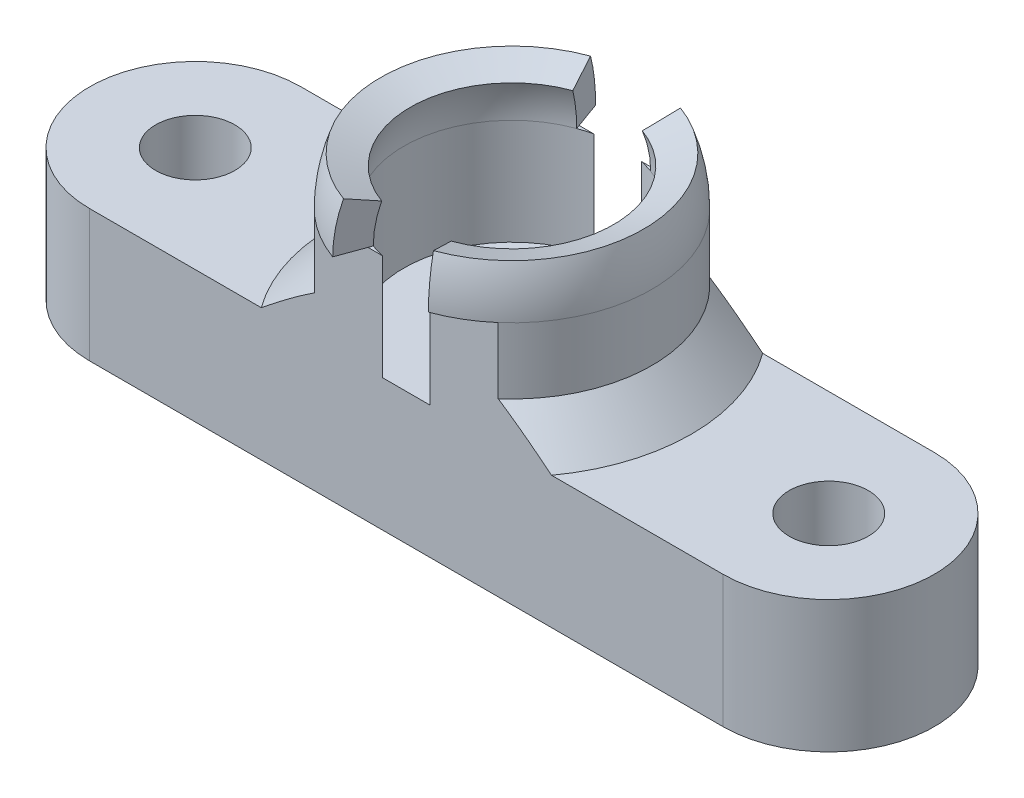
ISO-10303-21;
HEADER;
FILE_DESCRIPTION(('STEP AP214'),'2;1');
FILE_NAME('part.step','',(''),(''),'','','');
FILE_SCHEMA(('AUTOMOTIVE_DESIGN { 1 0 10303 214 1 1 1 1 }'));
ENDSEC;
DATA;
#1=APPLICATION_CONTEXT('core data for automotive mechanical design processes');
#2=APPLICATION_PROTOCOL_DEFINITION('international standard','automotive_design',2000,#1);
#3=PRODUCT_CONTEXT('',#1,'mechanical');
#4=PRODUCT('Part','Part','',(#3));
#5=PRODUCT_RELATED_PRODUCT_CATEGORY('part','',(#4));
#6=PRODUCT_DEFINITION_FORMATION('','',#4);
#7=PRODUCT_DEFINITION_CONTEXT('part definition',#1,'design');
#8=PRODUCT_DEFINITION('design','',#6,#7);
#9=PRODUCT_DEFINITION_SHAPE('','',#8);
#10=(LENGTH_UNIT() NAMED_UNIT(*) SI_UNIT(.MILLI.,.METRE.));
#11=(NAMED_UNIT(*) PLANE_ANGLE_UNIT() SI_UNIT($,.RADIAN.));
#12=(NAMED_UNIT(*) SI_UNIT($,.STERADIAN.) SOLID_ANGLE_UNIT());
#13=UNCERTAINTY_MEASURE_WITH_UNIT(LENGTH_MEASURE(1.E-05),#10,'distance_accuracy_value','');
#14=(GEOMETRIC_REPRESENTATION_CONTEXT(3) GLOBAL_UNCERTAINTY_ASSIGNED_CONTEXT((#13)) GLOBAL_UNIT_ASSIGNED_CONTEXT((#10,
#11,#12)) REPRESENTATION_CONTEXT('',''));
#15=CARTESIAN_POINT('',(0.,0.,0.));
#16=DIRECTION('',(0.,0.,1.));
#17=DIRECTION('',(1.,0.,0.));
#18=AXIS2_PLACEMENT_3D('',#15,#16,#17);
#19=CARTESIAN_POINT('',(0.,9.,0.));
#20=DIRECTION('',(0.,1.,0.));
#21=DIRECTION('',(0.,0.,1.));
#22=AXIS2_PLACEMENT_3D('',#19,#20,#21);
#23=PLANE('',#22);
#24=DIRECTION('',(-1.,0.,0.));
#25=VECTOR('',#24,1.);
#26=CARTESIAN_POINT('',(0.,9.,-4.));
#27=LINE('',#26,#25);
#28=CARTESIAN_POINT('',(-0.89999999999999,9.,-4.));
#29=VERTEX_POINT('',#28);
#30=CARTESIAN_POINT('',(-1.4558809370648,9.,-4.));
#31=VERTEX_POINT('',#30);
#32=EDGE_CURVE('E294',#29,#31,#27,.T.);
#33=ORIENTED_EDGE('',*,*,#32,.T.);
#34=DIRECTION('',(-0.342020143325666,0.,-0.93969262078591));
#35=VECTOR('',#34,1.);
#36=CARTESIAN_POINT('',(0.,9.,0.));
#37=LINE('',#36,#35);
#38=CARTESIAN_POINT('',(-1.40228258763523,9.,-3.85273974522223));
#39=VERTEX_POINT('',#38);
#40=EDGE_CURVE('E236',#39,#31,#37,.T.);
#41=ORIENTED_EDGE('',*,*,#40,.F.);
#42=CARTESIAN_POINT('',(0.,9.,0.));
#43=DIRECTION('',(0.,1.,0.));
#44=DIRECTION('',(0.,0.,1.));
#45=AXIS2_PLACEMENT_3D('',#42,#43,#44);
#46=CIRCLE('',#45,4.1);
#47=EDGE_CURVE('E304',#29,#39,#46,.T.);
#48=ORIENTED_EDGE('',*,*,#47,.F.);
#49=EDGE_LOOP('',(#33,#41,#48));
#50=FACE_BOUND('',#49,.T.);
#51=ADVANCED_FACE('F43',(#50),#23,.T.);
#52=CARTESIAN_POINT('',(0.,9.,0.));
#53=DIRECTION('',(0.,1.,0.));
#54=DIRECTION('',(0.,0.,1.));
#55=AXIS2_PLACEMENT_3D('',#52,#53,#54);
#56=PLANE('',#55);
#57=CARTESIAN_POINT('',(0.,9.,0.));
#58=DIRECTION('',(0.,1.,0.));
#59=DIRECTION('',(0.,0.,1.));
#60=AXIS2_PLACEMENT_3D('',#57,#58,#59);
#61=CIRCLE('',#60,4.1);
#62=CARTESIAN_POINT('',(0.899999999999988,9.,-4.));
#63=VERTEX_POINT('',#62);
#64=CARTESIAN_POINT('',(1.40228258763523,9.,-3.85273974522223));
#65=VERTEX_POINT('',#64);
#66=EDGE_CURVE('E331',#63,#65,#61,.F.);
#67=ORIENTED_EDGE('',*,*,#66,.T.);
#68=DIRECTION('',(0.342020143325666,0.,-0.93969262078591));
#69=VECTOR('',#68,1.);
#70=CARTESIAN_POINT('',(0.,9.,0.));
#71=LINE('',#70,#69);
#72=CARTESIAN_POINT('',(1.4558809370648,9.,-4.));
#73=VERTEX_POINT('',#72);
#74=EDGE_CURVE('E271',#65,#73,#71,.T.);
#75=ORIENTED_EDGE('',*,*,#74,.T.);
#76=DIRECTION('',(-1.,0.,0.));
#77=VECTOR('',#76,1.);
#78=CARTESIAN_POINT('',(0.,9.,-4.));
#79=LINE('',#78,#77);
#80=EDGE_CURVE('E326',#73,#63,#79,.T.);
#81=ORIENTED_EDGE('',*,*,#80,.T.);
#82=EDGE_LOOP('',(#67,#75,#81));
#83=FACE_BOUND('',#82,.T.);
#84=ADVANCED_FACE('F490',(#83),#56,.T.);
#85=CARTESIAN_POINT('',(0.,5.,0.));
#86=DIRECTION('',(0.,1.,0.));
#87=DIRECTION('',(0.,0.,1.));
#88=AXIS2_PLACEMENT_3D('',#85,#86,#87);
#89=PLANE('',#88);
#90=CARTESIAN_POINT('',(-12.,5.,0.));
#91=DIRECTION('',(0.,1.,0.));
#92=DIRECTION('',(0.,0.,1.));
#93=AXIS2_PLACEMENT_3D('',#90,#91,#92);
#94=CIRCLE('',#93,1.5);
#95=CARTESIAN_POINT('',(-12.,5.,1.5));
#96=VERTEX_POINT('',#95);
#97=EDGE_CURVE('E366',#96,#96,#94,.T.);
#98=ORIENTED_EDGE('',*,*,#97,.F.);
#99=EDGE_LOOP('',(#98));
#100=FACE_BOUND('',#99,.T.);
#101=DIRECTION('',(-1.,0.,0.));
#102=VECTOR('',#101,1.);
#103=CARTESIAN_POINT('',(0.,5.,4.));
#104=LINE('',#103,#102);
#105=CARTESIAN_POINT('',(-5.49909083394701,5.,4.));
#106=VERTEX_POINT('',#105);
#107=CARTESIAN_POINT('',(-12.,5.,4.));
#108=VERTEX_POINT('',#107);
#109=EDGE_CURVE('E363',#106,#108,#104,.T.);
#110=ORIENTED_EDGE('',*,*,#109,.F.);
#111=CARTESIAN_POINT('',(0.,5.,0.));
#112=DIRECTION('',(0.,1.,0.));
#113=DIRECTION('',(0.,0.,1.));
#114=AXIS2_PLACEMENT_3D('',#111,#112,#113);
#115=CIRCLE('',#114,6.8);
#116=CARTESIAN_POINT('',(-5.499090833947,5.,-4.));
#117=VERTEX_POINT('',#116);
#118=EDGE_CURVE('E397',#106,#117,#115,.F.);
#119=ORIENTED_EDGE('',*,*,#118,.T.);
#120=DIRECTION('',(1.,0.,0.));
#121=VECTOR('',#120,1.);
#122=CARTESIAN_POINT('',(0.,5.,-4.));
#123=LINE('',#122,#121);
#124=CARTESIAN_POINT('',(-12.,5.,-4.));
#125=VERTEX_POINT('',#124);
#126=EDGE_CURVE('E356',#125,#117,#123,.T.);
#127=ORIENTED_EDGE('',*,*,#126,.F.);
#128=CARTESIAN_POINT('',(-12.,5.,0.));
#129=DIRECTION('',(0.,1.,0.));
#130=DIRECTION('',(0.,0.,1.));
#131=AXIS2_PLACEMENT_3D('',#128,#129,#130);
#132=CIRCLE('',#131,4.);
#133=EDGE_CURVE('E359',#108,#125,#132,.F.);
#134=ORIENTED_EDGE('',*,*,#133,.F.);
#135=EDGE_LOOP('',(#110,#119,#127,#134));
#136=FACE_BOUND('',#135,.T.);
#137=ADVANCED_FACE('F453',(#100,#136),#89,.T.);
#138=CARTESIAN_POINT('',(-0.89999999999999,5.,-4.));
#139=VERTEX_POINT('',#138);
#140=CARTESIAN_POINT('',(0.899999999999988,5.,-4.));
#141=VERTEX_POINT('',#140);
#142=EDGE_CURVE('E360',#139,#141,#123,.T.);
#143=ORIENTED_EDGE('',*,*,#142,.F.);
#144=CARTESIAN_POINT('',(0.,5.,0.));
#145=DIRECTION('',(0.,1.,0.));
#146=DIRECTION('',(0.,0.,1.));
#147=AXIS2_PLACEMENT_3D('',#144,#145,#146);
#148=CIRCLE('',#147,4.1);
#149=CARTESIAN_POINT('',(-0.900000000000005,5.,4.));
#150=VERTEX_POINT('',#149);
#151=EDGE_CURVE('E308',#139,#150,#148,.T.);
#152=ORIENTED_EDGE('',*,*,#151,.T.);
#153=CARTESIAN_POINT('',(0.900000000000007,5.,4.));
#154=VERTEX_POINT('',#153);
#155=EDGE_CURVE('E367',#154,#150,#104,.T.);
#156=ORIENTED_EDGE('',*,*,#155,.F.);
#157=CARTESIAN_POINT('',(0.,5.,0.));
#158=DIRECTION('',(0.,1.,0.));
#159=DIRECTION('',(0.,0.,1.));
#160=AXIS2_PLACEMENT_3D('',#157,#158,#159);
#161=CIRCLE('',#160,4.1);
#162=EDGE_CURVE('E293',#141,#154,#161,.F.);
#163=ORIENTED_EDGE('',*,*,#162,.F.);
#164=EDGE_LOOP('',(#143,#152,#156,#163));
#165=FACE_BOUND('',#164,.T.);
#166=ADVANCED_FACE('F567',(#165),#89,.T.);
#167=CARTESIAN_POINT('',(12.,5.,0.));
#168=DIRECTION('',(0.,-1.,0.));
#169=DIRECTION('',(0.,0.,-1.));
#170=AXIS2_PLACEMENT_3D('',#167,#168,#169);
#171=CYLINDRICAL_SURFACE('',#170,4.);
#172=CARTESIAN_POINT('',(12.,0.,0.));
#173=DIRECTION('',(0.,1.,0.));
#174=DIRECTION('',(0.,0.,1.));
#175=AXIS2_PLACEMENT_3D('',#172,#173,#174);
#176=CIRCLE('',#175,4.);
#177=CARTESIAN_POINT('',(12.,0.,-4.));
#178=VERTEX_POINT('',#177);
#179=CARTESIAN_POINT('',(12.,0.,4.));
#180=VERTEX_POINT('',#179);
#181=EDGE_CURVE('E373',#178,#180,#176,.F.);
#182=ORIENTED_EDGE('',*,*,#181,.F.);
#183=DIRECTION('',(0.,-1.,0.));
#184=VECTOR('',#183,1.);
#185=CARTESIAN_POINT('',(12.,5.,-4.));
#186=LINE('',#185,#184);
#187=CARTESIAN_POINT('',(12.,5.,-4.));
#188=VERTEX_POINT('',#187);
#189=EDGE_CURVE('E392',#188,#178,#186,.T.);
#190=ORIENTED_EDGE('',*,*,#189,.F.);
#191=CARTESIAN_POINT('',(12.,5.,0.));
#192=DIRECTION('',(0.,1.,0.));
#193=DIRECTION('',(0.,0.,1.));
#194=AXIS2_PLACEMENT_3D('',#191,#192,#193);
#195=CIRCLE('',#194,4.);
#196=CARTESIAN_POINT('',(12.,5.,4.));
#197=VERTEX_POINT('',#196);
#198=EDGE_CURVE('E351',#188,#197,#195,.F.);
#199=ORIENTED_EDGE('',*,*,#198,.T.);
#200=DIRECTION('',(0.,-1.,0.));
#201=VECTOR('',#200,1.);
#202=CARTESIAN_POINT('',(12.,5.,4.));
#203=LINE('',#202,#201);
#204=EDGE_CURVE('E370',#197,#180,#203,.T.);
#205=ORIENTED_EDGE('',*,*,#204,.T.);
#206=EDGE_LOOP('',(#182,#190,#199,#205));
#207=FACE_BOUND('',#206,.T.);
#208=ADVANCED_FACE('F523',(#207),#171,.T.);
#209=CARTESIAN_POINT('',(0.,5.,-4.));
#210=DIRECTION('',(0.,0.,-1.));
#211=DIRECTION('',(-1.,0.,0.));
#212=AXIS2_PLACEMENT_3D('',#209,#210,#211);
#213=PLANE('',#212);
#214=DIRECTION('',(1.,0.,0.));
#215=VECTOR('',#214,1.);
#216=CARTESIAN_POINT('',(0.,0.,-4.));
#217=LINE('',#216,#215);
#218=CARTESIAN_POINT('',(-12.,0.,-4.));
#219=VERTEX_POINT('',#218);
#220=EDGE_CURVE('E376',#219,#178,#217,.T.);
#221=ORIENTED_EDGE('',*,*,#220,.F.);
#222=DIRECTION('',(0.,-1.,0.));
#223=VECTOR('',#222,1.);
#224=CARTESIAN_POINT('',(-12.,5.,-4.));
#225=LINE('',#224,#223);
#226=EDGE_CURVE('E390',#125,#219,#225,.T.);
#227=ORIENTED_EDGE('',*,*,#226,.F.);
#228=ORIENTED_EDGE('',*,*,#126,.T.);
#229=CARTESIAN_POINT('',(-5.499090833947,5.,-4.));
#230=CARTESIAN_POINT('',(-5.33583991350035,5.13196161324045,-4.));
#231=CARTESIAN_POINT('',(-5.17163626009542,5.26277078409141,-4.));
#232=CARTESIAN_POINT('',(-4.84089385745095,5.52119396351482,-4.));
#233=CARTESIAN_POINT('',(-4.67435654673117,5.64880981609131,-4.));
#234=CARTESIAN_POINT('',(-4.33828886818103,5.90014137534846,-4.));
#235=CARTESIAN_POINT('',(-4.16875785851448,6.0238562294378,-4.));
#236=CARTESIAN_POINT('',(-3.91166889987826,6.20558465723264,-4.));
#237=CARTESIAN_POINT('',(-3.82548112102879,6.26553741792785,-4.));
#238=CARTESIAN_POINT('',(-3.65207405573403,6.38394517771257,-4.));
#239=CARTESIAN_POINT('',(-3.56485469184516,6.44240006329642,-4.));
#240=CARTESIAN_POINT('',(-3.47706773014274,6.50000000000001,-4.));
#241=B_SPLINE_CURVE_WITH_KNOTS('',3,(#229,#230,#231,#232,#233,#234,#235,#236,#237,#238,#239,
#240),.UNSPECIFIED.,.F.,.F.,(4,2,2,2,2,4),(0.,0.629766314738074,1.25916015749011,
1.88869061854379,2.20364326728059,2.51861971227456),.UNSPECIFIED.);
#242=CARTESIAN_POINT('',(-3.47706773014274,6.50000000000001,-4.));
#243=VERTEX_POINT('',#242);
#244=EDGE_CURVE('E410',#117,#243,#241,.T.);
#245=ORIENTED_EDGE('',*,*,#244,.T.);
#246=DIRECTION('',(0.,-1.,0.));
#247=VECTOR('',#246,1.);
#248=CARTESIAN_POINT('',(-3.47706773014274,9.,-4.));
#249=LINE('',#248,#247);
#250=CARTESIAN_POINT('',(-3.47706773014274,9.,-4.));
#251=VERTEX_POINT('',#250);
#252=EDGE_CURVE('E319',#251,#243,#249,.T.);
#253=ORIENTED_EDGE('',*,*,#252,.F.);
#254=EDGE_CURVE('E298',#31,#251,#27,.T.);
#255=ORIENTED_EDGE('',*,*,#254,.F.);
#256=ORIENTED_EDGE('',*,*,#32,.F.);
#257=DIRECTION('',(0.,-1.,0.));
#258=VECTOR('',#257,1.);
#259=CARTESIAN_POINT('',(-0.89999999999999,9.,-4.));
#260=LINE('',#259,#258);
#261=EDGE_CURVE('E307',#29,#139,#260,.T.);
#262=ORIENTED_EDGE('',*,*,#261,.T.);
#263=ORIENTED_EDGE('',*,*,#142,.T.);
#264=DIRECTION('',(0.,-1.,0.));
#265=VECTOR('',#264,1.);
#266=CARTESIAN_POINT('',(0.899999999999988,9.,-4.));
#267=LINE('',#266,#265);
#268=EDGE_CURVE('E344',#63,#141,#267,.T.);
#269=ORIENTED_EDGE('',*,*,#268,.F.);
#270=ORIENTED_EDGE('',*,*,#80,.F.);
#271=CARTESIAN_POINT('',(3.47706773014274,9.,-4.));
#272=VERTEX_POINT('',#271);
#273=EDGE_CURVE('E327',#272,#73,#79,.T.);
#274=ORIENTED_EDGE('',*,*,#273,.F.);
#275=DIRECTION('',(0.,-1.,0.));
#276=VECTOR('',#275,1.);
#277=CARTESIAN_POINT('',(3.47706773014274,9.,-4.));
#278=LINE('',#277,#276);
#279=CARTESIAN_POINT('',(3.47706773014274,6.49999999999999,-4.));
#280=VERTEX_POINT('',#279);
#281=EDGE_CURVE('E310',#272,#280,#278,.T.);
#282=ORIENTED_EDGE('',*,*,#281,.T.);
#283=CARTESIAN_POINT('',(3.47706773014274,6.49999999999999,-4.));
#284=CARTESIAN_POINT('',(3.56485469184516,6.4424000632964,-4.));
#285=CARTESIAN_POINT('',(3.65207405573403,6.38394517771255,-4.));
#286=CARTESIAN_POINT('',(3.82548112102879,6.26553741792783,-4.));
#287=CARTESIAN_POINT('',(3.91166889987826,6.20558465723262,-4.));
#288=CARTESIAN_POINT('',(4.16875785851448,6.02385622943778,-4.));
#289=CARTESIAN_POINT('',(4.33828886818103,5.90014137534845,-4.));
#290=CARTESIAN_POINT('',(4.67435654673118,5.6488098160913,-4.));
#291=CARTESIAN_POINT('',(4.84089385745096,5.52119396351482,-4.));
#292=CARTESIAN_POINT('',(5.17163626009543,5.2627707840914,-4.));
#293=CARTESIAN_POINT('',(5.33583991350035,5.13196161324044,-4.));
#294=CARTESIAN_POINT('',(5.49909083394701,5.,-4.));
#295=B_SPLINE_CURVE_WITH_KNOTS('',3,(#283,#284,#285,#286,#287,#288,#289,#290,#291,#292,#293,
#294),.UNSPECIFIED.,.F.,.F.,(4,2,2,2,2,4),(0.,0.314976444993972,0.629929093730764,
1.25945955478445,1.88885339753648,2.51861971227455),.UNSPECIFIED.);
#296=CARTESIAN_POINT('',(5.49909083394701,5.,-4.));
#297=VERTEX_POINT('',#296);
#298=EDGE_CURVE('E11',#280,#297,#295,.T.);
#299=ORIENTED_EDGE('',*,*,#298,.T.);
#300=EDGE_CURVE('E355',#297,#188,#123,.T.);
#301=ORIENTED_EDGE('',*,*,#300,.T.);
#302=ORIENTED_EDGE('',*,*,#189,.T.);
#303=EDGE_LOOP('',(#221,#227,#228,#245,#253,#255,#256,#262,#263,#269,#270,#274,#282,#299,#301,#302));
#304=FACE_BOUND('',#303,.T.);
#305=ADVANCED_FACE('F437',(#304),#213,.T.);
#306=CARTESIAN_POINT('',(-12.,5.,0.));
#307=DIRECTION('',(0.,-1.,0.));
#308=DIRECTION('',(0.,0.,-1.));
#309=AXIS2_PLACEMENT_3D('',#306,#307,#308);
#310=CYLINDRICAL_SURFACE('',#309,4.);
#311=CARTESIAN_POINT('',(-12.,0.,0.));
#312=DIRECTION('',(0.,1.,0.));
#313=DIRECTION('',(0.,0.,1.));
#314=AXIS2_PLACEMENT_3D('',#311,#312,#313);
#315=CIRCLE('',#314,4.);
#316=CARTESIAN_POINT('',(-12.,0.,4.));
#317=VERTEX_POINT('',#316);
#318=EDGE_CURVE('E379',#317,#219,#315,.F.);
#319=ORIENTED_EDGE('',*,*,#318,.F.);
#320=DIRECTION('',(0.,-1.,0.));
#321=VECTOR('',#320,1.);
#322=CARTESIAN_POINT('',(-12.,5.,4.));
#323=LINE('',#322,#321);
#324=EDGE_CURVE('E388',#108,#317,#323,.T.);
#325=ORIENTED_EDGE('',*,*,#324,.F.);
#326=ORIENTED_EDGE('',*,*,#133,.T.);
#327=ORIENTED_EDGE('',*,*,#226,.T.);
#328=EDGE_LOOP('',(#319,#325,#326,#327));
#329=FACE_BOUND('',#328,.T.);
#330=ADVANCED_FACE('F425',(#329),#310,.T.);
#331=CARTESIAN_POINT('',(0.,5.,4.));
#332=DIRECTION('',(0.,0.,1.));
#333=DIRECTION('',(1.,0.,0.));
#334=AXIS2_PLACEMENT_3D('',#331,#332,#333);
#335=PLANE('',#334);
#336=DIRECTION('',(-1.,0.,0.));
#337=VECTOR('',#336,1.);
#338=CARTESIAN_POINT('',(0.,0.,4.));
#339=LINE('',#338,#337);
#340=EDGE_CURVE('E382',#180,#317,#339,.T.);
#341=ORIENTED_EDGE('',*,*,#340,.F.);
#342=ORIENTED_EDGE('',*,*,#204,.F.);
#343=CARTESIAN_POINT('',(5.49909083394701,5.,4.));
#344=VERTEX_POINT('',#343);
#345=EDGE_CURVE('E364',#197,#344,#104,.T.);
#346=ORIENTED_EDGE('',*,*,#345,.T.);
#347=CARTESIAN_POINT('',(5.49909083394701,5.,4.));
#348=CARTESIAN_POINT('',(5.33583991350036,5.13196161324044,4.));
#349=CARTESIAN_POINT('',(5.17163626009543,5.2627707840914,4.));
#350=CARTESIAN_POINT('',(4.84089385745096,5.52119396351482,4.));
#351=CARTESIAN_POINT('',(4.67435654673118,5.6488098160913,4.));
#352=CARTESIAN_POINT('',(4.33828886818104,5.90014137534845,4.));
#353=CARTESIAN_POINT('',(4.16875785851449,6.02385622943778,4.));
#354=CARTESIAN_POINT('',(3.91166889987826,6.20558465723262,4.));
#355=CARTESIAN_POINT('',(3.8254811210288,6.26553741792783,4.));
#356=CARTESIAN_POINT('',(3.65207405573404,6.38394517771255,4.));
#357=CARTESIAN_POINT('',(3.56485469184516,6.4424000632964,4.));
#358=CARTESIAN_POINT('',(3.47706773014274,6.49999999999999,4.));
#359=B_SPLINE_CURVE_WITH_KNOTS('',3,(#347,#348,#349,#350,#351,#352,#353,#354,#355,#356,#357,
#358),.UNSPECIFIED.,.F.,.F.,(4,2,2,2,2,4),(0.,0.629766314738071,1.2591601574901,
1.88869061854379,2.20364326728058,2.51861971227455),.UNSPECIFIED.);
#360=CARTESIAN_POINT('',(3.47706773014274,6.49999999999999,4.));
#361=VERTEX_POINT('',#360);
#362=EDGE_CURVE('E58',#344,#361,#359,.T.);
#363=ORIENTED_EDGE('',*,*,#362,.T.);
#364=DIRECTION('',(0.,-1.,0.));
#365=VECTOR('',#364,1.);
#366=CARTESIAN_POINT('',(3.47706773014274,9.,4.));
#367=LINE('',#366,#365);
#368=CARTESIAN_POINT('',(3.47706773014274,9.,4.));
#369=VERTEX_POINT('',#368);
#370=EDGE_CURVE('E337',#369,#361,#367,.T.);
#371=ORIENTED_EDGE('',*,*,#370,.F.);
#372=DIRECTION('',(1.,0.,0.));
#373=VECTOR('',#372,1.);
#374=CARTESIAN_POINT('',(0.,9.,4.));
#375=LINE('',#374,#373);
#376=CARTESIAN_POINT('',(1.4558809370648,9.,4.));
#377=VERTEX_POINT('',#376);
#378=EDGE_CURVE('E334',#377,#369,#375,.T.);
#379=ORIENTED_EDGE('',*,*,#378,.F.);
#380=CARTESIAN_POINT('',(0.900000000000007,9.,4.));
#381=VERTEX_POINT('',#380);
#382=EDGE_CURVE('E335',#381,#377,#375,.T.);
#383=ORIENTED_EDGE('',*,*,#382,.F.);
#384=DIRECTION('',(0.,-1.,0.));
#385=VECTOR('',#384,1.);
#386=CARTESIAN_POINT('',(0.900000000000007,9.,4.));
#387=LINE('',#386,#385);
#388=EDGE_CURVE('E341',#381,#154,#387,.T.);
#389=ORIENTED_EDGE('',*,*,#388,.T.);
#390=ORIENTED_EDGE('',*,*,#155,.T.);
#391=DIRECTION('',(0.,-1.,0.));
#392=VECTOR('',#391,1.);
#393=CARTESIAN_POINT('',(-0.900000000000005,9.,4.));
#394=LINE('',#393,#392);
#395=CARTESIAN_POINT('',(-0.900000000000005,9.,4.));
#396=VERTEX_POINT('',#395);
#397=EDGE_CURVE('E313',#396,#150,#394,.T.);
#398=ORIENTED_EDGE('',*,*,#397,.F.);
#399=DIRECTION('',(1.,0.,0.));
#400=VECTOR('',#399,1.);
#401=CARTESIAN_POINT('',(0.,9.,4.));
#402=LINE('',#401,#400);
#403=CARTESIAN_POINT('',(-1.4558809370648,9.,4.));
#404=VERTEX_POINT('',#403);
#405=EDGE_CURVE('E300',#404,#396,#402,.T.);
#406=ORIENTED_EDGE('',*,*,#405,.F.);
#407=CARTESIAN_POINT('',(-3.47706773014274,9.,4.));
#408=VERTEX_POINT('',#407);
#409=EDGE_CURVE('E301',#408,#404,#402,.T.);
#410=ORIENTED_EDGE('',*,*,#409,.F.);
#411=DIRECTION('',(0.,-1.,0.));
#412=VECTOR('',#411,1.);
#413=CARTESIAN_POINT('',(-3.47706773014274,9.,4.));
#414=LINE('',#413,#412);
#415=CARTESIAN_POINT('',(-3.47706773014274,6.50000000000001,4.));
#416=VERTEX_POINT('',#415);
#417=EDGE_CURVE('E316',#408,#416,#414,.T.);
#418=ORIENTED_EDGE('',*,*,#417,.T.);
#419=CARTESIAN_POINT('',(-3.47706773014274,6.50000000000001,4.));
#420=CARTESIAN_POINT('',(-3.56485469184516,6.44240006329642,4.));
#421=CARTESIAN_POINT('',(-3.65207405573404,6.38394517771257,4.));
#422=CARTESIAN_POINT('',(-3.8254811210288,6.26553741792785,4.));
#423=CARTESIAN_POINT('',(-3.91166889987826,6.20558465723264,4.));
#424=CARTESIAN_POINT('',(-4.16875785851448,6.0238562294378,4.));
#425=CARTESIAN_POINT('',(-4.33828886818103,5.90014137534846,4.));
#426=CARTESIAN_POINT('',(-4.67435654673117,5.64880981609131,4.));
#427=CARTESIAN_POINT('',(-4.84089385745096,5.52119396351482,4.));
#428=CARTESIAN_POINT('',(-5.17163626009542,5.26277078409141,4.));
#429=CARTESIAN_POINT('',(-5.33583991350035,5.13196161324045,4.));
#430=CARTESIAN_POINT('',(-5.49909083394701,5.,4.));
#431=B_SPLINE_CURVE_WITH_KNOTS('',3,(#419,#420,#421,#422,#423,#424,#425,#426,#427,#428,#429,
#430),.UNSPECIFIED.,.F.,.F.,(4,2,2,2,2,4),(0.,0.314976444993971,0.629929093730764,
1.25945955478445,1.88885339753648,2.51861971227456),.UNSPECIFIED.);
#432=EDGE_CURVE('E403',#416,#106,#431,.T.);
#433=ORIENTED_EDGE('',*,*,#432,.T.);
#434=ORIENTED_EDGE('',*,*,#109,.T.);
#435=ORIENTED_EDGE('',*,*,#324,.T.);
#436=EDGE_LOOP('',(#341,#342,#346,#363,#371,#379,#383,#389,#390,#398,#406,#410,#418,#433,#434,#435));
#437=FACE_BOUND('',#436,.T.);
#438=ADVANCED_FACE('F419',(#437),#335,.T.);
#439=CARTESIAN_POINT('',(12.,5.,0.));
#440=DIRECTION('',(0.,-1.,0.));
#441=DIRECTION('',(0.,0.,-1.));
#442=AXIS2_PLACEMENT_3D('',#439,#440,#441);
#443=CYLINDRICAL_SURFACE('',#442,1.5);
#444=CARTESIAN_POINT('',(12.,5.,0.));
#445=DIRECTION('',(0.,1.,0.));
#446=DIRECTION('',(0.,0.,1.));
#447=AXIS2_PLACEMENT_3D('',#444,#445,#446);
#448=CIRCLE('',#447,1.5);
#449=CARTESIAN_POINT('',(12.,5.,1.5));
#450=VERTEX_POINT('',#449);
#451=EDGE_CURVE('E348',#450,#450,#448,.T.);
#452=ORIENTED_EDGE('',*,*,#451,.T.);
#453=EDGE_LOOP('',(#452));
#454=FACE_BOUND('',#453,.T.);
#455=CARTESIAN_POINT('',(12.,0.,0.));
#456=DIRECTION('',(0.,1.,0.));
#457=DIRECTION('',(0.,0.,1.));
#458=AXIS2_PLACEMENT_3D('',#455,#456,#457);
#459=CIRCLE('',#458,1.5);
#460=CARTESIAN_POINT('',(12.,0.,1.5));
#461=VERTEX_POINT('',#460);
#462=EDGE_CURVE('E322',#461,#461,#459,.T.);
#463=ORIENTED_EDGE('',*,*,#462,.F.);
#464=EDGE_LOOP('',(#463));
#465=FACE_BOUND('',#464,.T.);
#466=ADVANCED_FACE('F424',(#454,#465),#443,.F.);
#467=CARTESIAN_POINT('',(-12.,5.,0.));
#468=DIRECTION('',(0.,-1.,0.));
#469=DIRECTION('',(0.,0.,-1.));
#470=AXIS2_PLACEMENT_3D('',#467,#468,#469);
#471=CYLINDRICAL_SURFACE('',#470,1.5);
#472=ORIENTED_EDGE('',*,*,#97,.T.);
#473=EDGE_LOOP('',(#472));
#474=FACE_BOUND('',#473,.T.);
#475=CARTESIAN_POINT('',(-12.,0.,0.));
#476=DIRECTION('',(0.,1.,0.));
#477=DIRECTION('',(0.,0.,1.));
#478=AXIS2_PLACEMENT_3D('',#475,#476,#477);
#479=CIRCLE('',#478,1.5);
#480=CARTESIAN_POINT('',(-12.,0.,1.5));
#481=VERTEX_POINT('',#480);
#482=EDGE_CURVE('E352',#481,#481,#479,.T.);
#483=ORIENTED_EDGE('',*,*,#482,.F.);
#484=EDGE_LOOP('',(#483));
#485=FACE_BOUND('',#484,.T.);
#486=ADVANCED_FACE('F426',(#474,#485),#471,.F.);
#487=ORIENTED_EDGE('',*,*,#451,.F.);
#488=EDGE_LOOP('',(#487));
#489=FACE_BOUND('',#488,.T.);
#490=ORIENTED_EDGE('',*,*,#300,.F.);
#491=CARTESIAN_POINT('',(0.,5.,0.));
#492=DIRECTION('',(0.,1.,0.));
#493=DIRECTION('',(0.,0.,1.));
#494=AXIS2_PLACEMENT_3D('',#491,#492,#493);
#495=CIRCLE('',#494,6.8);
#496=EDGE_CURVE('E399',#297,#344,#495,.F.);
#497=ORIENTED_EDGE('',*,*,#496,.T.);
#498=ORIENTED_EDGE('',*,*,#345,.F.);
#499=ORIENTED_EDGE('',*,*,#198,.F.);
#500=EDGE_LOOP('',(#490,#497,#498,#499));
#501=FACE_BOUND('',#500,.T.);
#502=ADVANCED_FACE('F518',(#489,#501),#89,.T.);
#503=CARTESIAN_POINT('',(0.,0.,0.));
#504=DIRECTION('',(0.,1.,0.));
#505=DIRECTION('',(0.,0.,1.));
#506=AXIS2_PLACEMENT_3D('',#503,#504,#505);
#507=PLANE('',#506);
#508=ORIENTED_EDGE('',*,*,#462,.T.);
#509=EDGE_LOOP('',(#508));
#510=FACE_BOUND('',#509,.T.);
#511=ORIENTED_EDGE('',*,*,#181,.T.);
#512=ORIENTED_EDGE('',*,*,#340,.T.);
#513=ORIENTED_EDGE('',*,*,#318,.T.);
#514=ORIENTED_EDGE('',*,*,#220,.T.);
#515=EDGE_LOOP('',(#511,#512,#513,#514));
#516=FACE_BOUND('',#515,.T.);
#517=ORIENTED_EDGE('',*,*,#482,.T.);
#518=EDGE_LOOP('',(#517));
#519=FACE_BOUND('',#518,.T.);
#520=ADVANCED_FACE('F526',(#510,#516,#519),#507,.F.);
#521=CARTESIAN_POINT('',(0.,9.,0.));
#522=DIRECTION('',(0.,-1.,0.));
#523=DIRECTION('',(0.,0.,-1.));
#524=AXIS2_PLACEMENT_3D('',#521,#522,#523);
#525=CYLINDRICAL_SURFACE('',#524,5.3);
#526=ORIENTED_EDGE('',*,*,#370,.T.);
#527=CARTESIAN_POINT('',(0.,6.49999999999999,0.));
#528=DIRECTION('',(0.,1.,0.));
#529=DIRECTION('',(0.,0.,1.));
#530=AXIS2_PLACEMENT_3D('',#527,#528,#529);
#531=CIRCLE('',#530,5.3);
#532=EDGE_CURVE('E71',#361,#280,#531,.T.);
#533=ORIENTED_EDGE('',*,*,#532,.T.);
#534=ORIENTED_EDGE('',*,*,#281,.F.);
#535=CARTESIAN_POINT('',(0.,9.,0.));
#536=DIRECTION('',(0.,1.,0.));
#537=DIRECTION('',(0.,0.,1.));
#538=AXIS2_PLACEMENT_3D('',#535,#536,#537);
#539=CIRCLE('',#538,5.3);
#540=EDGE_CURVE('E323',#272,#369,#539,.F.);
#541=ORIENTED_EDGE('',*,*,#540,.T.);
#542=EDGE_LOOP('',(#526,#533,#534,#541));
#543=FACE_BOUND('',#542,.T.);
#544=ADVANCED_FACE('F562',(#543),#525,.T.);
#545=CARTESIAN_POINT('',(0.,9.,0.));
#546=DIRECTION('',(0.,-1.,0.));
#547=DIRECTION('',(0.,0.,-1.));
#548=AXIS2_PLACEMENT_3D('',#545,#546,#547);
#549=CYLINDRICAL_SURFACE('',#548,4.1);
#550=ORIENTED_EDGE('',*,*,#162,.T.);
#551=ORIENTED_EDGE('',*,*,#388,.F.);
#552=CARTESIAN_POINT('',(1.40228258763523,9.,3.85273974522223));
#553=VERTEX_POINT('',#552);
#554=EDGE_CURVE('E330',#553,#381,#61,.F.);
#555=ORIENTED_EDGE('',*,*,#554,.F.);
#556=CARTESIAN_POINT('',(0.,9.,0.));
#557=DIRECTION('',(0.,-1.,0.));
#558=DIRECTION('',(0.,0.,-1.));
#559=AXIS2_PLACEMENT_3D('',#556,#557,#558);
#560=CIRCLE('',#559,4.1);
#561=EDGE_CURVE('E282',#65,#553,#560,.T.);
#562=ORIENTED_EDGE('',*,*,#561,.F.);
#563=ORIENTED_EDGE('',*,*,#66,.F.);
#564=ORIENTED_EDGE('',*,*,#268,.T.);
#565=EDGE_LOOP('',(#550,#551,#555,#562,#563,#564));
#566=FACE_BOUND('',#565,.T.);
#567=ADVANCED_FACE('F486',(#566),#549,.F.);
#568=DIRECTION('',(0.342020143325666,0.,0.93969262078591));
#569=VECTOR('',#568,1.);
#570=CARTESIAN_POINT('',(0.,9.,0.));
#571=LINE('',#570,#569);
#572=EDGE_CURVE('E258',#553,#377,#571,.T.);
#573=ORIENTED_EDGE('',*,*,#572,.F.);
#574=ORIENTED_EDGE('',*,*,#554,.T.);
#575=ORIENTED_EDGE('',*,*,#382,.T.);
#576=EDGE_LOOP('',(#573,#574,#575));
#577=FACE_BOUND('',#576,.T.);
#578=ADVANCED_FACE('F543',(#577),#56,.T.);
#579=CARTESIAN_POINT('',(0.,9.,0.));
#580=DIRECTION('',(0.,-1.,0.));
#581=DIRECTION('',(0.,0.,-1.));
#582=AXIS2_PLACEMENT_3D('',#579,#580,#581);
#583=CYLINDRICAL_SURFACE('',#582,5.3);
#584=ORIENTED_EDGE('',*,*,#252,.T.);
#585=CARTESIAN_POINT('',(0.,6.50000000000001,0.));
#586=DIRECTION('',(0.,1.,0.));
#587=DIRECTION('',(0.,0.,1.));
#588=AXIS2_PLACEMENT_3D('',#585,#586,#587);
#589=CIRCLE('',#588,5.3);
#590=EDGE_CURVE('E394',#243,#416,#589,.T.);
#591=ORIENTED_EDGE('',*,*,#590,.T.);
#592=ORIENTED_EDGE('',*,*,#417,.F.);
#593=CARTESIAN_POINT('',(0.,9.,0.));
#594=DIRECTION('',(0.,1.,0.));
#595=DIRECTION('',(0.,0.,1.));
#596=AXIS2_PLACEMENT_3D('',#593,#594,#595);
#597=CIRCLE('',#596,5.3);
#598=EDGE_CURVE('E297',#251,#408,#597,.T.);
#599=ORIENTED_EDGE('',*,*,#598,.F.);
#600=EDGE_LOOP('',(#584,#591,#592,#599));
#601=FACE_BOUND('',#600,.T.);
#602=ADVANCED_FACE('F445',(#601),#583,.T.);
#603=CARTESIAN_POINT('',(0.,9.,0.));
#604=DIRECTION('',(0.,-1.,0.));
#605=DIRECTION('',(0.,0.,-1.));
#606=AXIS2_PLACEMENT_3D('',#603,#604,#605);
#607=CYLINDRICAL_SURFACE('',#606,4.1);
#608=ORIENTED_EDGE('',*,*,#151,.F.);
#609=ORIENTED_EDGE('',*,*,#261,.F.);
#610=ORIENTED_EDGE('',*,*,#47,.T.);
#611=CARTESIAN_POINT('',(0.,9.,0.));
#612=DIRECTION('',(0.,-1.,0.));
#613=DIRECTION('',(0.,0.,-1.));
#614=AXIS2_PLACEMENT_3D('',#611,#612,#613);
#615=CIRCLE('',#614,4.1);
#616=CARTESIAN_POINT('',(-1.40228258763523,9.,3.85273974522223));
#617=VERTEX_POINT('',#616);
#618=EDGE_CURVE('E252',#617,#39,#615,.T.);
#619=ORIENTED_EDGE('',*,*,#618,.F.);
#620=EDGE_CURVE('E303',#617,#396,#46,.T.);
#621=ORIENTED_EDGE('',*,*,#620,.T.);
#622=ORIENTED_EDGE('',*,*,#397,.T.);
#623=EDGE_LOOP('',(#608,#609,#610,#619,#621,#622));
#624=FACE_BOUND('',#623,.T.);
#625=ADVANCED_FACE('F462',(#624),#607,.F.);
#626=DIRECTION('',(-0.342020143325666,0.,0.93969262078591));
#627=VECTOR('',#626,1.);
#628=CARTESIAN_POINT('',(0.,9.,0.));
#629=LINE('',#628,#627);
#630=EDGE_CURVE('E245',#617,#404,#629,.T.);
#631=ORIENTED_EDGE('',*,*,#630,.T.);
#632=ORIENTED_EDGE('',*,*,#405,.T.);
#633=ORIENTED_EDGE('',*,*,#620,.F.);
#634=EDGE_LOOP('',(#631,#632,#633));
#635=FACE_BOUND('',#634,.T.);
#636=ADVANCED_FACE('F467',(#635),#23,.T.);
#637=CARTESIAN_POINT('',(0.,9.,0.));
#638=DIRECTION('',(0.,-1.,0.));
#639=DIRECTION('',(0.,0.,-1.));
#640=AXIS2_PLACEMENT_3D('',#637,#638,#639);
#641=PLANE('',#640);
#642=CARTESIAN_POINT('',(0.,9.,0.));
#643=DIRECTION('',(0.,-1.,0.));
#644=DIRECTION('',(0.,0.,-1.));
#645=AXIS2_PLACEMENT_3D('',#642,#643,#644);
#646=CIRCLE('',#645,5.3);
#647=CARTESIAN_POINT('',(1.81270675962603,9.,-4.98037089016532));
#648=VERTEX_POINT('',#647);
#649=EDGE_CURVE('E290',#648,#272,#646,.T.);
#650=ORIENTED_EDGE('',*,*,#649,.T.);
#651=ORIENTED_EDGE('',*,*,#273,.T.);
#652=EDGE_CURVE('E270',#73,#648,#71,.T.);
#653=ORIENTED_EDGE('',*,*,#652,.T.);
#654=EDGE_LOOP('',(#650,#651,#653));
#655=FACE_BOUND('',#654,.T.);
#656=ADVANCED_FACE('F510',(#655),#641,.T.);
#657=CARTESIAN_POINT('',(1.81270675962603,9.,4.98037089016532));
#658=VERTEX_POINT('',#657);
#659=EDGE_CURVE('E221',#377,#658,#571,.T.);
#660=ORIENTED_EDGE('',*,*,#659,.F.);
#661=ORIENTED_EDGE('',*,*,#378,.T.);
#662=EDGE_CURVE('E289',#369,#658,#646,.T.);
#663=ORIENTED_EDGE('',*,*,#662,.T.);
#664=EDGE_LOOP('',(#660,#661,#663));
#665=FACE_BOUND('',#664,.T.);
#666=ADVANCED_FACE('F551',(#665),#641,.T.);
#667=CARTESIAN_POINT('',(0.,9.,0.));
#668=DIRECTION('',(0.,-1.,0.));
#669=DIRECTION('',(0.342020143325666,0.,-0.93969262078591));
#670=AXIS2_PLACEMENT_3D('',#667,#668,#669);
#671=SPHERICAL_SURFACE('',#670,5.3);
#672=CARTESIAN_POINT('',(0.,10.812706759626,0.));
#673=DIRECTION('',(0.,-1.,0.));
#674=DIRECTION('',(0.,0.,-1.));
#675=AXIS2_PLACEMENT_3D('',#672,#673,#674);
#676=CIRCLE('',#675,4.98037089016532);
#677=CARTESIAN_POINT('',(1.70338716566932,10.812706759626,-4.6800177742653));
#678=VERTEX_POINT('',#677);
#679=CARTESIAN_POINT('',(1.70338716566932,10.812706759626,4.6800177742653));
#680=VERTEX_POINT('',#679);
#681=EDGE_CURVE('E287',#678,#680,#676,.T.);
#682=ORIENTED_EDGE('',*,*,#681,.T.);
#683=CARTESIAN_POINT('',(0.,9.,0.));
#684=DIRECTION('',(-0.93969262078591,0.,0.342020143325666));
#685=DIRECTION('',(0.342020143325666,0.,0.93969262078591));
#686=AXIS2_PLACEMENT_3D('',#683,#684,#685);
#687=CIRCLE('',#686,5.3);
#688=EDGE_CURVE('E261',#658,#680,#687,.T.);
#689=ORIENTED_EDGE('',*,*,#688,.F.);
#690=ORIENTED_EDGE('',*,*,#662,.F.);
#691=ORIENTED_EDGE('',*,*,#540,.F.);
#692=ORIENTED_EDGE('',*,*,#649,.F.);
#693=CARTESIAN_POINT('',(0.,9.,0.));
#694=DIRECTION('',(0.93969262078591,0.,0.342020143325666));
#695=DIRECTION('',(0.342020143325666,0.,-0.93969262078591));
#696=AXIS2_PLACEMENT_3D('',#693,#694,#695);
#697=CIRCLE('',#696,5.3);
#698=EDGE_CURVE('E273',#648,#678,#697,.T.);
#699=ORIENTED_EDGE('',*,*,#698,.T.);
#700=EDGE_LOOP('',(#682,#689,#690,#691,#692,#699));
#701=FACE_BOUND('',#700,.T.);
#702=ADVANCED_FACE('F505',(#701),#671,.T.);
#703=CARTESIAN_POINT('',(0.,10.4022825876352,0.));
#704=DIRECTION('',(0.,1.,0.));
#705=DIRECTION('',(0.,0.,1.));
#706=AXIS2_PLACEMENT_3D('',#703,#704,#705);
#707=CONICAL_SURFACE('',#706,3.85273974522222,1.22173047639603);
#708=CARTESIAN_POINT('',(0.,10.4022825876352,0.));
#709=DIRECTION('',(0.,-1.,0.));
#710=DIRECTION('',(0.,0.,-1.));
#711=AXIS2_PLACEMENT_3D('',#708,#709,#710);
#712=CIRCLE('',#711,3.85273974522222);
#713=CARTESIAN_POINT('',(1.3177145998574,10.4022825876352,-3.62039110839391));
#714=VERTEX_POINT('',#713);
#715=CARTESIAN_POINT('',(1.3177145998574,10.4022825876352,3.62039110839391));
#716=VERTEX_POINT('',#715);
#717=EDGE_CURVE('E285',#714,#716,#712,.T.);
#718=ORIENTED_EDGE('',*,*,#717,.T.);
#719=DIRECTION('',(0.321393804843267,0.342020143325669,0.88302222155949));
#720=VECTOR('',#719,1.);
#721=CARTESIAN_POINT('',(-0.989308396768287,7.9471999940354,-2.71810248099775));
#722=LINE('',#721,#720);
#723=EDGE_CURVE('E264',#716,#680,#722,.T.);
#724=ORIENTED_EDGE('',*,*,#723,.T.);
#725=ORIENTED_EDGE('',*,*,#681,.F.);
#726=DIRECTION('',(0.321393804843267,0.342020143325669,-0.88302222155949));
#727=VECTOR('',#726,1.);
#728=CARTESIAN_POINT('',(-0.989308396768287,7.9471999940354,2.71810248099775));
#729=LINE('',#728,#727);
#730=EDGE_CURVE('E276',#714,#678,#729,.T.);
#731=ORIENTED_EDGE('',*,*,#730,.F.);
#732=EDGE_LOOP('',(#718,#724,#725,#731));
#733=FACE_BOUND('',#732,.T.);
#734=ADVANCED_FACE('F502',(#733),#707,.F.);
#735=CARTESIAN_POINT('',(0.,9.,0.));
#736=DIRECTION('',(0.,-1.,0.));
#737=DIRECTION('',(0.342020143325666,0.,-0.93969262078591));
#738=AXIS2_PLACEMENT_3D('',#735,#736,#737);
#739=SPHERICAL_SURFACE('',#738,4.1);
#740=CARTESIAN_POINT('',(0.,9.,0.));
#741=DIRECTION('',(0.93969262078591,0.,0.342020143325666));
#742=DIRECTION('',(0.342020143325666,0.,-0.93969262078591));
#743=AXIS2_PLACEMENT_3D('',#740,#741,#742);
#744=CIRCLE('',#743,4.1);
#745=EDGE_CURVE('E279',#65,#714,#744,.T.);
#746=ORIENTED_EDGE('',*,*,#745,.F.);
#747=ORIENTED_EDGE('',*,*,#561,.T.);
#748=CARTESIAN_POINT('',(0.,9.,0.));
#749=DIRECTION('',(-0.93969262078591,0.,0.342020143325666));
#750=DIRECTION('',(0.342020143325666,0.,0.93969262078591));
#751=AXIS2_PLACEMENT_3D('',#748,#749,#750);
#752=CIRCLE('',#751,4.1);
#753=EDGE_CURVE('E267',#553,#716,#752,.T.);
#754=ORIENTED_EDGE('',*,*,#753,.T.);
#755=ORIENTED_EDGE('',*,*,#717,.F.);
#756=EDGE_LOOP('',(#746,#747,#754,#755));
#757=FACE_BOUND('',#756,.T.);
#758=ADVANCED_FACE('F497',(#757),#739,.F.);
#759=CARTESIAN_POINT('',(0.,0.,0.));
#760=DIRECTION('',(0.93969262078591,0.,0.342020143325666));
#761=DIRECTION('',(0.342020143325666,0.,-0.93969262078591));
#762=AXIS2_PLACEMENT_3D('',#759,#760,#761);
#763=PLANE('',#762);
#764=ORIENTED_EDGE('',*,*,#74,.F.);
#765=ORIENTED_EDGE('',*,*,#745,.T.);
#766=ORIENTED_EDGE('',*,*,#730,.T.);
#767=ORIENTED_EDGE('',*,*,#698,.F.);
#768=ORIENTED_EDGE('',*,*,#652,.F.);
#769=EDGE_LOOP('',(#764,#765,#766,#767,#768));
#770=FACE_BOUND('',#769,.T.);
#771=ADVANCED_FACE('F494',(#770),#763,.F.);
#772=CARTESIAN_POINT('',(0.,0.,0.));
#773=DIRECTION('',(-0.93969262078591,0.,0.342020143325666));
#774=DIRECTION('',(0.342020143325666,0.,0.93969262078591));
#775=AXIS2_PLACEMENT_3D('',#772,#773,#774);
#776=PLANE('',#775);
#777=ORIENTED_EDGE('',*,*,#572,.T.);
#778=ORIENTED_EDGE('',*,*,#659,.T.);
#779=ORIENTED_EDGE('',*,*,#688,.T.);
#780=ORIENTED_EDGE('',*,*,#723,.F.);
#781=ORIENTED_EDGE('',*,*,#753,.F.);
#782=EDGE_LOOP('',(#777,#778,#779,#780,#781));
#783=FACE_BOUND('',#782,.T.);
#784=ADVANCED_FACE('F691',(#783),#776,.T.);
#785=CARTESIAN_POINT('',(0.,9.,0.));
#786=DIRECTION('',(0.,-1.,0.));
#787=DIRECTION('',(0.,0.,-1.));
#788=AXIS2_PLACEMENT_3D('',#785,#786,#787);
#789=PLANE('',#788);
#790=CARTESIAN_POINT('',(-1.81270675962603,9.,-4.98037089016532));
#791=VERTEX_POINT('',#790);
#792=EDGE_CURVE('E234',#31,#791,#37,.T.);
#793=ORIENTED_EDGE('',*,*,#792,.F.);
#794=ORIENTED_EDGE('',*,*,#254,.T.);
#795=CARTESIAN_POINT('',(0.,9.,0.));
#796=DIRECTION('',(0.,-1.,0.));
#797=DIRECTION('',(0.,0.,-1.));
#798=AXIS2_PLACEMENT_3D('',#795,#796,#797);
#799=CIRCLE('',#798,5.3);
#800=EDGE_CURVE('E255',#251,#791,#799,.T.);
#801=ORIENTED_EDGE('',*,*,#800,.T.);
#802=EDGE_LOOP('',(#793,#794,#801));
#803=FACE_BOUND('',#802,.T.);
#804=ADVANCED_FACE('F671',(#803),#789,.T.);
#805=CARTESIAN_POINT('',(0.,10.812706759626,0.));
#806=DIRECTION('',(0.,1.,0.));
#807=DIRECTION('',(0.,0.,1.));
#808=AXIS2_PLACEMENT_3D('',#805,#806,#807);
#809=CONICAL_SURFACE('',#808,4.98037089016532,1.22173047639603);
#810=CARTESIAN_POINT('',(0.,10.812706759626,0.));
#811=DIRECTION('',(0.,-1.,0.));
#812=DIRECTION('',(0.,0.,-1.));
#813=AXIS2_PLACEMENT_3D('',#810,#811,#812);
#814=CIRCLE('',#813,4.98037089016532);
#815=CARTESIAN_POINT('',(-1.70338716566932,10.812706759626,4.6800177742653));
#816=VERTEX_POINT('',#815);
#817=CARTESIAN_POINT('',(-1.70338716566932,10.812706759626,-4.6800177742653));
#818=VERTEX_POINT('',#817);
#819=EDGE_CURVE('E209',#816,#818,#814,.T.);
#820=ORIENTED_EDGE('',*,*,#819,.F.);
#821=DIRECTION('',(0.321393804843267,-0.34202014332567,-0.88302222155949));
#822=VECTOR('',#821,1.);
#823=CARTESIAN_POINT('',(0.98930839676829,7.94719999403539,-2.71810248099775));
#824=LINE('',#823,#822);
#825=CARTESIAN_POINT('',(-1.3177145998574,10.4022825876352,3.62039110839391));
#826=VERTEX_POINT('',#825);
#827=EDGE_CURVE('E241',#816,#826,#824,.T.);
#828=ORIENTED_EDGE('',*,*,#827,.T.);
#829=CARTESIAN_POINT('',(0.,10.4022825876352,0.));
#830=DIRECTION('',(0.,-1.,0.));
#831=DIRECTION('',(0.,0.,-1.));
#832=AXIS2_PLACEMENT_3D('',#829,#830,#831);
#833=CIRCLE('',#832,3.85273974522222);
#834=CARTESIAN_POINT('',(-1.3177145998574,10.4022825876352,-3.62039110839391));
#835=VERTEX_POINT('',#834);
#836=EDGE_CURVE('E227',#826,#835,#833,.T.);
#837=ORIENTED_EDGE('',*,*,#836,.T.);
#838=DIRECTION('',(0.321393804843267,-0.34202014332567,0.88302222155949));
#839=VECTOR('',#838,1.);
#840=CARTESIAN_POINT('',(0.98930839676829,7.94719999403539,2.71810248099775));
#841=LINE('',#840,#839);
#842=EDGE_CURVE('E225',#818,#835,#841,.T.);
#843=ORIENTED_EDGE('',*,*,#842,.F.);
#844=EDGE_LOOP('',(#820,#828,#837,#843));
#845=FACE_BOUND('',#844,.T.);
#846=ADVANCED_FACE('F226',(#845),#809,.F.);
#847=CARTESIAN_POINT('',(0.,9.,0.));
#848=DIRECTION('',(0.,-1.,0.));
#849=DIRECTION('',(-0.342020143325666,0.,0.93969262078591));
#850=AXIS2_PLACEMENT_3D('',#847,#848,#849);
#851=SPHERICAL_SURFACE('',#850,5.3);
#852=CARTESIAN_POINT('',(-1.81270675962603,9.,4.98037089016532));
#853=VERTEX_POINT('',#852);
#854=EDGE_CURVE('E222',#853,#408,#799,.T.);
#855=ORIENTED_EDGE('',*,*,#854,.F.);
#856=CARTESIAN_POINT('',(0.,9.,0.));
#857=DIRECTION('',(0.93969262078591,0.,0.342020143325666));
#858=DIRECTION('',(0.342020143325666,0.,-0.93969262078591));
#859=AXIS2_PLACEMENT_3D('',#856,#857,#858);
#860=CIRCLE('',#859,5.3);
#861=EDGE_CURVE('E217',#816,#853,#860,.T.);
#862=ORIENTED_EDGE('',*,*,#861,.F.);
#863=ORIENTED_EDGE('',*,*,#819,.T.);
#864=CARTESIAN_POINT('',(0.,9.,0.));
#865=DIRECTION('',(-0.93969262078591,0.,0.342020143325666));
#866=DIRECTION('',(0.342020143325666,0.,0.93969262078591));
#867=AXIS2_PLACEMENT_3D('',#864,#865,#866);
#868=CIRCLE('',#867,5.3);
#869=EDGE_CURVE('E215',#818,#791,#868,.T.);
#870=ORIENTED_EDGE('',*,*,#869,.T.);
#871=ORIENTED_EDGE('',*,*,#800,.F.);
#872=ORIENTED_EDGE('',*,*,#598,.T.);
#873=EDGE_LOOP('',(#855,#862,#863,#870,#871,#872));
#874=FACE_BOUND('',#873,.T.);
#875=ADVANCED_FACE('F212',(#874),#851,.T.);
#876=ORIENTED_EDGE('',*,*,#854,.T.);
#877=ORIENTED_EDGE('',*,*,#409,.T.);
#878=EDGE_CURVE('E244',#404,#853,#629,.T.);
#879=ORIENTED_EDGE('',*,*,#878,.T.);
#880=EDGE_LOOP('',(#876,#877,#879));
#881=FACE_BOUND('',#880,.T.);
#882=ADVANCED_FACE('F470',(#881),#789,.T.);
#883=CARTESIAN_POINT('',(0.,9.,0.));
#884=DIRECTION('',(0.,-1.,0.));
#885=DIRECTION('',(-0.342020143325666,0.,0.93969262078591));
#886=AXIS2_PLACEMENT_3D('',#883,#884,#885);
#887=SPHERICAL_SURFACE('',#886,4.1);
#888=CARTESIAN_POINT('',(0.,9.,0.));
#889=DIRECTION('',(0.93969262078591,0.,0.342020143325666));
#890=DIRECTION('',(0.342020143325666,0.,-0.93969262078591));
#891=AXIS2_PLACEMENT_3D('',#888,#889,#890);
#892=CIRCLE('',#891,4.1);
#893=EDGE_CURVE('E248',#826,#617,#892,.T.);
#894=ORIENTED_EDGE('',*,*,#893,.T.);
#895=ORIENTED_EDGE('',*,*,#618,.T.);
#896=CARTESIAN_POINT('',(0.,9.,0.));
#897=DIRECTION('',(-0.93969262078591,0.,0.342020143325666));
#898=DIRECTION('',(0.342020143325666,0.,0.93969262078591));
#899=AXIS2_PLACEMENT_3D('',#896,#897,#898);
#900=CIRCLE('',#899,4.1);
#901=EDGE_CURVE('E239',#835,#39,#900,.T.);
#902=ORIENTED_EDGE('',*,*,#901,.F.);
#903=ORIENTED_EDGE('',*,*,#836,.F.);
#904=EDGE_LOOP('',(#894,#895,#902,#903));
#905=FACE_BOUND('',#904,.T.);
#906=ADVANCED_FACE('F475',(#905),#887,.F.);
#907=CARTESIAN_POINT('',(0.,0.,0.));
#908=DIRECTION('',(0.93969262078591,0.,0.342020143325666));
#909=DIRECTION('',(0.342020143325666,0.,-0.93969262078591));
#910=AXIS2_PLACEMENT_3D('',#907,#908,#909);
#911=PLANE('',#910);
#912=ORIENTED_EDGE('',*,*,#827,.F.);
#913=ORIENTED_EDGE('',*,*,#861,.T.);
#914=ORIENTED_EDGE('',*,*,#878,.F.);
#915=ORIENTED_EDGE('',*,*,#630,.F.);
#916=ORIENTED_EDGE('',*,*,#893,.F.);
#917=EDGE_LOOP('',(#912,#913,#914,#915,#916));
#918=FACE_BOUND('',#917,.T.);
#919=ADVANCED_FACE('F472',(#918),#911,.T.);
#920=CARTESIAN_POINT('',(0.,0.,0.));
#921=DIRECTION('',(-0.93969262078591,0.,0.342020143325666));
#922=DIRECTION('',(0.342020143325666,0.,0.93969262078591));
#923=AXIS2_PLACEMENT_3D('',#920,#921,#922);
#924=PLANE('',#923);
#925=ORIENTED_EDGE('',*,*,#842,.T.);
#926=ORIENTED_EDGE('',*,*,#901,.T.);
#927=ORIENTED_EDGE('',*,*,#40,.T.);
#928=ORIENTED_EDGE('',*,*,#792,.T.);
#929=ORIENTED_EDGE('',*,*,#869,.F.);
#930=EDGE_LOOP('',(#925,#926,#927,#928,#929));
#931=FACE_BOUND('',#930,.T.);
#932=ADVANCED_FACE('F232',(#931),#924,.F.);
#933=CARTESIAN_POINT('',(0.,6.50000000000001,0.));
#934=DIRECTION('',(0.,-1.,0.));
#935=DIRECTION('',(0.,0.,-1.));
#936=AXIS2_PLACEMENT_3D('',#933,#934,#935);
#937=CONICAL_SURFACE('',#936,5.3,0.785398163397443);
#938=ORIENTED_EDGE('',*,*,#244,.F.);
#939=ORIENTED_EDGE('',*,*,#118,.F.);
#940=ORIENTED_EDGE('',*,*,#432,.F.);
#941=ORIENTED_EDGE('',*,*,#590,.F.);
#942=EDGE_LOOP('',(#938,#939,#940,#941));
#943=FACE_BOUND('',#942,.T.);
#944=ADVANCED_FACE('F416',(#943),#937,.T.);
#945=CARTESIAN_POINT('',(0.,5.,0.));
#946=DIRECTION('',(0.,-1.,0.));
#947=DIRECTION('',(0.,0.,-1.));
#948=AXIS2_PLACEMENT_3D('',#945,#946,#947);
#949=CONICAL_SURFACE('',#948,6.8,0.785398163397453);
#950=ORIENTED_EDGE('',*,*,#298,.F.);
#951=ORIENTED_EDGE('',*,*,#532,.F.);
#952=ORIENTED_EDGE('',*,*,#362,.F.);
#953=ORIENTED_EDGE('',*,*,#496,.F.);
#954=EDGE_LOOP('',(#950,#951,#952,#953));
#955=FACE_BOUND('',#954,.T.);
#956=ADVANCED_FACE('F46',(#955),#949,.T.);
#957=CLOSED_SHELL('',(#51,#84,#137,#166,#208,#305,#330,#438,#466,#486,#502,#520,#544,#567,#578,
#602,#625,#636,#656,#666,#702,#734,#758,#771,#784,#804,#846,#875,#882,#906,#919,#932,#944,#956));
#958=MANIFOLD_SOLID_BREP('B2',#957);
#959=ADVANCED_BREP_SHAPE_REPRESENTATION('',(#18,#958),#14);
#960=SHAPE_DEFINITION_REPRESENTATION(#9,#959);
ENDSEC;
END-ISO-10303-21;
